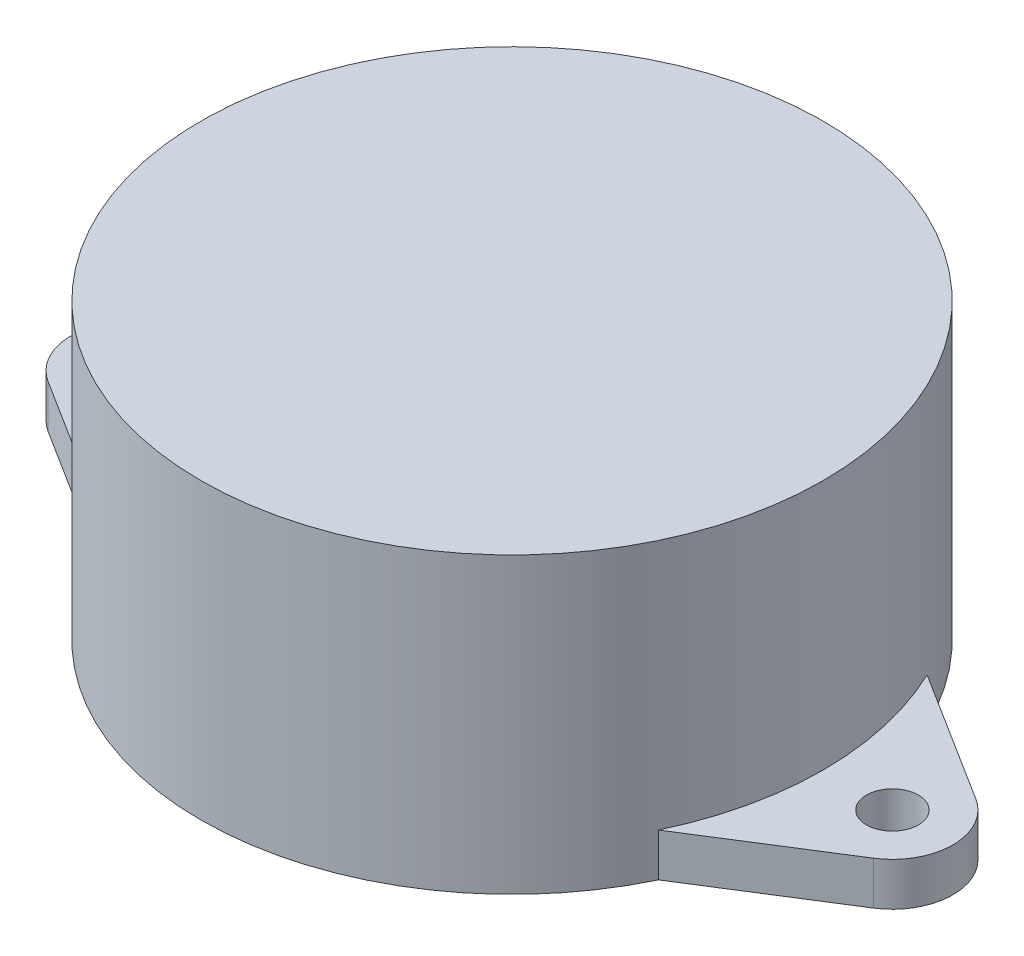
ISO-10303-21;
HEADER;
FILE_DESCRIPTION(('STEP AP214'),'2;1');
FILE_NAME('part.step','',(''),(''),'','','');
FILE_SCHEMA(('AUTOMOTIVE_DESIGN { 1 0 10303 214 1 1 1 1 }'));
ENDSEC;
DATA;
#1=APPLICATION_CONTEXT('core data for automotive mechanical design processes');
#2=APPLICATION_PROTOCOL_DEFINITION('international standard','automotive_design',2000,#1);
#3=PRODUCT_CONTEXT('',#1,'mechanical');
#4=PRODUCT('Part','Part','',(#3));
#5=PRODUCT_RELATED_PRODUCT_CATEGORY('part','',(#4));
#6=PRODUCT_DEFINITION_FORMATION('','',#4);
#7=PRODUCT_DEFINITION_CONTEXT('part definition',#1,'design');
#8=PRODUCT_DEFINITION('design','',#6,#7);
#9=PRODUCT_DEFINITION_SHAPE('','',#8);
#10=(LENGTH_UNIT() NAMED_UNIT(*) SI_UNIT(.MILLI.,.METRE.));
#11=(NAMED_UNIT(*) PLANE_ANGLE_UNIT() SI_UNIT($,.RADIAN.));
#12=(NAMED_UNIT(*) SI_UNIT($,.STERADIAN.) SOLID_ANGLE_UNIT());
#13=UNCERTAINTY_MEASURE_WITH_UNIT(LENGTH_MEASURE(1.E-05),#10,'distance_accuracy_value','');
#14=(GEOMETRIC_REPRESENTATION_CONTEXT(3) GLOBAL_UNCERTAINTY_ASSIGNED_CONTEXT((#13)) GLOBAL_UNIT_ASSIGNED_CONTEXT((#10,
#11,#12)) REPRESENTATION_CONTEXT('',''));
#15=CARTESIAN_POINT('',(0.,0.,0.));
#16=DIRECTION('',(0.,0.,1.));
#17=DIRECTION('',(1.,0.,0.));
#18=AXIS2_PLACEMENT_3D('',#15,#16,#17);
#19=CARTESIAN_POINT('',(0.,2.5,0.));
#20=DIRECTION('',(0.,1.,0.));
#21=DIRECTION('',(0.,0.,1.));
#22=AXIS2_PLACEMENT_3D('',#19,#20,#21);
#23=PLANE('',#22);
#24=CARTESIAN_POINT('',(-22.,2.5,0.));
#25=DIRECTION('',(0.,1.,0.));
#26=DIRECTION('',(0.,0.,1.));
#27=AXIS2_PLACEMENT_3D('',#24,#25,#26);
#28=CIRCLE('',#27,1.5);
#29=CARTESIAN_POINT('',(-22.,2.5,1.5));
#30=VERTEX_POINT('',#29);
#31=EDGE_CURVE('E138',#30,#30,#28,.T.);
#32=ORIENTED_EDGE('',*,*,#31,.F.);
#33=EDGE_LOOP('',(#32));
#34=FACE_BOUND('',#33,.T.);
#35=DIRECTION('',(0.846038247877732,0.,0.533122202809053));
#36=VECTOR('',#35,1.);
#37=CARTESIAN_POINT('',(-23.8659277098317,2.5,2.96113386757206));
#38=LINE('',#37,#36);
#39=CARTESIAN_POINT('',(-23.8659277098317,2.5,2.96113386757206));
#40=VERTEX_POINT('',#39);
#41=CARTESIAN_POINT('',(-16.2375038772944,2.5,7.76810580739281));
#42=VERTEX_POINT('',#41);
#43=EDGE_CURVE('E119',#40,#42,#38,.T.);
#44=ORIENTED_EDGE('',*,*,#43,.T.);
#45=CARTESIAN_POINT('',(0.,2.5,0.));
#46=DIRECTION('',(0.,1.,0.));
#47=DIRECTION('',(0.,0.,1.));
#48=AXIS2_PLACEMENT_3D('',#45,#46,#47);
#49=CIRCLE('',#48,18.);
#50=CARTESIAN_POINT('',(-16.2375038772944,2.5,-7.76810580739281));
#51=VERTEX_POINT('',#50);
#52=EDGE_CURVE('E98',#42,#51,#49,.F.);
#53=ORIENTED_EDGE('',*,*,#52,.T.);
#54=DIRECTION('',(-0.846038247877732,0.,0.533122202809053));
#55=VECTOR('',#54,1.);
#56=CARTESIAN_POINT('',(-16.2375038772944,2.5,-7.76810580739281));
#57=LINE('',#56,#55);
#58=CARTESIAN_POINT('',(-23.8659277098317,2.5,-2.96113386757206));
#59=VERTEX_POINT('',#58);
#60=EDGE_CURVE('E149',#51,#59,#57,.T.);
#61=ORIENTED_EDGE('',*,*,#60,.T.);
#62=CARTESIAN_POINT('',(-22.,2.5,0.));
#63=DIRECTION('',(0.,1.,0.));
#64=DIRECTION('',(0.,0.,1.));
#65=AXIS2_PLACEMENT_3D('',#62,#63,#64);
#66=CIRCLE('',#65,3.5);
#67=EDGE_CURVE('E190',#59,#40,#66,.T.);
#68=ORIENTED_EDGE('',*,*,#67,.T.);
#69=EDGE_LOOP('',(#44,#53,#61,#68));
#70=FACE_BOUND('',#69,.T.);
#71=ADVANCED_FACE('F34',(#34,#70),#23,.T.);
#72=CARTESIAN_POINT('',(22.,2.5,0.));
#73=DIRECTION('',(0.,1.,0.));
#74=DIRECTION('',(0.,0.,-1.));
#75=AXIS2_PLACEMENT_3D('',#72,#73,#74);
#76=CIRCLE('',#75,1.5);
#77=CARTESIAN_POINT('',(22.,2.5,-1.5));
#78=VERTEX_POINT('',#77);
#79=EDGE_CURVE('E178',#78,#78,#76,.T.);
#80=ORIENTED_EDGE('',*,*,#79,.F.);
#81=EDGE_LOOP('',(#80));
#82=FACE_BOUND('',#81,.T.);
#83=DIRECTION('',(-0.846038247877732,0.,-0.533122202809053));
#84=VECTOR('',#83,1.);
#85=CARTESIAN_POINT('',(16.2375038772944,2.5,-7.76810580739281));
#86=LINE('',#85,#84);
#87=CARTESIAN_POINT('',(23.8659277098317,2.5,-2.96113386757206));
#88=VERTEX_POINT('',#87);
#89=CARTESIAN_POINT('',(16.2375038772944,2.5,-7.76810580739281));
#90=VERTEX_POINT('',#89);
#91=EDGE_CURVE('E53',#88,#90,#86,.T.);
#92=ORIENTED_EDGE('',*,*,#91,.T.);
#93=CARTESIAN_POINT('',(16.2375038772944,2.5,7.76810580739281));
#94=VERTEX_POINT('',#93);
#95=EDGE_CURVE('E115',#90,#94,#49,.F.);
#96=ORIENTED_EDGE('',*,*,#95,.T.);
#97=DIRECTION('',(0.846038247877732,0.,-0.533122202809053));
#98=VECTOR('',#97,1.);
#99=CARTESIAN_POINT('',(23.8659277098317,2.5,2.96113386757206));
#100=LINE('',#99,#98);
#101=CARTESIAN_POINT('',(23.8659277098317,2.5,2.96113386757206));
#102=VERTEX_POINT('',#101);
#103=EDGE_CURVE('E109',#94,#102,#100,.T.);
#104=ORIENTED_EDGE('',*,*,#103,.T.);
#105=CARTESIAN_POINT('',(22.,2.5,0.));
#106=DIRECTION('',(0.,1.,0.));
#107=DIRECTION('',(0.,0.,-1.));
#108=AXIS2_PLACEMENT_3D('',#105,#106,#107);
#109=CIRCLE('',#108,3.5);
#110=EDGE_CURVE('E113',#102,#88,#109,.T.);
#111=ORIENTED_EDGE('',*,*,#110,.T.);
#112=EDGE_LOOP('',(#92,#96,#104,#111));
#113=FACE_BOUND('',#112,.T.);
#114=ADVANCED_FACE('F111',(#82,#113),#23,.T.);
#115=CARTESIAN_POINT('',(0.,0.,0.));
#116=DIRECTION('',(0.,1.,0.));
#117=DIRECTION('',(0.,0.,1.));
#118=AXIS2_PLACEMENT_3D('',#115,#116,#117);
#119=PLANE('',#118);
#120=CARTESIAN_POINT('',(0.,0.,0.));
#121=DIRECTION('',(0.,-1.,0.));
#122=DIRECTION('',(0.,0.,-1.));
#123=AXIS2_PLACEMENT_3D('',#120,#121,#122);
#124=CIRCLE('',#123,8.);
#125=CARTESIAN_POINT('',(0.,0.,-8.));
#126=VERTEX_POINT('',#125);
#127=EDGE_CURVE('E44',#126,#126,#124,.T.);
#128=ORIENTED_EDGE('',*,*,#127,.F.);
#129=EDGE_LOOP('',(#128));
#130=FACE_BOUND('',#129,.T.);
#131=CARTESIAN_POINT('',(0.,0.,0.));
#132=DIRECTION('',(0.,1.,0.));
#133=DIRECTION('',(0.,0.,1.));
#134=AXIS2_PLACEMENT_3D('',#131,#132,#133);
#135=CIRCLE('',#134,18.);
#136=CARTESIAN_POINT('',(-16.2375038772944,0.,7.76810580739281));
#137=VERTEX_POINT('',#136);
#138=CARTESIAN_POINT('',(16.2375038772944,0.,7.76810580739281));
#139=VERTEX_POINT('',#138);
#140=EDGE_CURVE('E144',#137,#139,#135,.T.);
#141=ORIENTED_EDGE('',*,*,#140,.F.);
#142=DIRECTION('',(0.846038247877732,0.,0.533122202809053));
#143=VECTOR('',#142,1.);
#144=CARTESIAN_POINT('',(-23.8659277098317,0.,2.96113386757206));
#145=LINE('',#144,#143);
#146=CARTESIAN_POINT('',(-23.8659277098317,0.,2.96113386757206));
#147=VERTEX_POINT('',#146);
#148=EDGE_CURVE('E142',#147,#137,#145,.T.);
#149=ORIENTED_EDGE('',*,*,#148,.F.);
#150=CARTESIAN_POINT('',(-22.,0.,0.));
#151=DIRECTION('',(0.,1.,0.));
#152=DIRECTION('',(0.,0.,1.));
#153=AXIS2_PLACEMENT_3D('',#150,#151,#152);
#154=CIRCLE('',#153,3.5);
#155=CARTESIAN_POINT('',(-23.8659277098317,0.,-2.96113386757206));
#156=VERTEX_POINT('',#155);
#157=EDGE_CURVE('E140',#156,#147,#154,.T.);
#158=ORIENTED_EDGE('',*,*,#157,.F.);
#159=DIRECTION('',(-0.846038247877732,0.,0.533122202809053));
#160=VECTOR('',#159,1.);
#161=CARTESIAN_POINT('',(-16.2375038772944,0.,-7.76810580739281));
#162=LINE('',#161,#160);
#163=CARTESIAN_POINT('',(-16.2375038772944,0.,-7.76810580739281));
#164=VERTEX_POINT('',#163);
#165=EDGE_CURVE('E137',#164,#156,#162,.T.);
#166=ORIENTED_EDGE('',*,*,#165,.F.);
#167=CARTESIAN_POINT('',(0.,0.,0.));
#168=DIRECTION('',(0.,1.,0.));
#169=DIRECTION('',(0.,0.,1.));
#170=AXIS2_PLACEMENT_3D('',#167,#168,#169);
#171=CIRCLE('',#170,18.);
#172=CARTESIAN_POINT('',(16.2375038772944,0.,-7.76810580739281));
#173=VERTEX_POINT('',#172);
#174=EDGE_CURVE('E134',#173,#164,#171,.T.);
#175=ORIENTED_EDGE('',*,*,#174,.F.);
#176=DIRECTION('',(-0.846038247877732,0.,-0.533122202809053));
#177=VECTOR('',#176,1.);
#178=CARTESIAN_POINT('',(16.2375038772944,0.,-7.76810580739281));
#179=LINE('',#178,#177);
#180=CARTESIAN_POINT('',(23.8659277098317,0.,-2.96113386757206));
#181=VERTEX_POINT('',#180);
#182=EDGE_CURVE('E89',#181,#173,#179,.T.);
#183=ORIENTED_EDGE('',*,*,#182,.F.);
#184=CARTESIAN_POINT('',(22.,0.,0.));
#185=DIRECTION('',(0.,1.,0.));
#186=DIRECTION('',(0.,0.,-1.));
#187=AXIS2_PLACEMENT_3D('',#184,#185,#186);
#188=CIRCLE('',#187,3.5);
#189=CARTESIAN_POINT('',(23.8659277098317,0.,2.96113386757206));
#190=VERTEX_POINT('',#189);
#191=EDGE_CURVE('E83',#190,#181,#188,.T.);
#192=ORIENTED_EDGE('',*,*,#191,.F.);
#193=DIRECTION('',(0.846038247877732,0.,-0.533122202809053));
#194=VECTOR('',#193,1.);
#195=CARTESIAN_POINT('',(23.8659277098317,0.,2.96113386757206));
#196=LINE('',#195,#194);
#197=EDGE_CURVE('E124',#139,#190,#196,.T.);
#198=ORIENTED_EDGE('',*,*,#197,.F.);
#199=EDGE_LOOP('',(#141,#149,#158,#166,#175,#183,#192,#198));
#200=FACE_BOUND('',#199,.T.);
#201=CARTESIAN_POINT('',(22.,0.,0.));
#202=DIRECTION('',(0.,1.,0.));
#203=DIRECTION('',(0.,0.,-1.));
#204=AXIS2_PLACEMENT_3D('',#201,#202,#203);
#205=CIRCLE('',#204,1.5);
#206=CARTESIAN_POINT('',(22.,0.,-1.5));
#207=VERTEX_POINT('',#206);
#208=EDGE_CURVE('E182',#207,#207,#205,.T.);
#209=ORIENTED_EDGE('',*,*,#208,.T.);
#210=EDGE_LOOP('',(#209));
#211=FACE_BOUND('',#210,.T.);
#212=CARTESIAN_POINT('',(-22.,0.,0.));
#213=DIRECTION('',(0.,1.,0.));
#214=DIRECTION('',(0.,0.,1.));
#215=AXIS2_PLACEMENT_3D('',#212,#213,#214);
#216=CIRCLE('',#215,1.5);
#217=CARTESIAN_POINT('',(-22.,0.,1.5));
#218=VERTEX_POINT('',#217);
#219=EDGE_CURVE('E181',#218,#218,#216,.T.);
#220=ORIENTED_EDGE('',*,*,#219,.T.);
#221=EDGE_LOOP('',(#220));
#222=FACE_BOUND('',#221,.T.);
#223=ADVANCED_FACE('F203',(#130,#200,#211,#222),#119,.F.);
#224=CARTESIAN_POINT('',(-16.2375038772944,2.5,-7.76810580739281));
#225=DIRECTION('',(0.533122202809053,0.,0.846038247877732));
#226=DIRECTION('',(0.846038247877732,0.,-0.533122202809053));
#227=AXIS2_PLACEMENT_3D('',#224,#225,#226);
#228=PLANE('',#227);
#229=ORIENTED_EDGE('',*,*,#165,.T.);
#230=DIRECTION('',(0.,-1.,0.));
#231=VECTOR('',#230,1.);
#232=CARTESIAN_POINT('',(-23.8659277098317,2.5,-2.96113386757206));
#233=LINE('',#232,#231);
#234=EDGE_CURVE('E158',#59,#156,#233,.T.);
#235=ORIENTED_EDGE('',*,*,#234,.F.);
#236=ORIENTED_EDGE('',*,*,#60,.F.);
#237=DIRECTION('',(0.,-1.,0.));
#238=VECTOR('',#237,1.);
#239=CARTESIAN_POINT('',(-16.2375038772944,2.5,-7.76810580739281));
#240=LINE('',#239,#238);
#241=EDGE_CURVE('E38',#51,#164,#240,.T.);
#242=ORIENTED_EDGE('',*,*,#241,.T.);
#243=EDGE_LOOP('',(#229,#235,#236,#242));
#244=FACE_BOUND('',#243,.T.);
#245=ADVANCED_FACE('F36',(#244),#228,.F.);
#246=CARTESIAN_POINT('',(-22.,2.5,0.));
#247=DIRECTION('',(0.,-1.,0.));
#248=DIRECTION('',(0.,0.,-1.));
#249=AXIS2_PLACEMENT_3D('',#246,#247,#248);
#250=CYLINDRICAL_SURFACE('',#249,3.5);
#251=ORIENTED_EDGE('',*,*,#157,.T.);
#252=DIRECTION('',(0.,-1.,0.));
#253=VECTOR('',#252,1.);
#254=CARTESIAN_POINT('',(-23.8659277098317,2.5,2.96113386757206));
#255=LINE('',#254,#253);
#256=EDGE_CURVE('E156',#40,#147,#255,.T.);
#257=ORIENTED_EDGE('',*,*,#256,.F.);
#258=ORIENTED_EDGE('',*,*,#67,.F.);
#259=ORIENTED_EDGE('',*,*,#234,.T.);
#260=EDGE_LOOP('',(#251,#257,#258,#259));
#261=FACE_BOUND('',#260,.T.);
#262=ADVANCED_FACE('F205',(#261),#250,.T.);
#263=CARTESIAN_POINT('',(-23.8659277098317,2.5,2.96113386757206));
#264=DIRECTION('',(0.533122202809053,0.,-0.846038247877732));
#265=DIRECTION('',(-0.846038247877732,0.,-0.533122202809053));
#266=AXIS2_PLACEMENT_3D('',#263,#264,#265);
#267=PLANE('',#266);
#268=ORIENTED_EDGE('',*,*,#148,.T.);
#269=DIRECTION('',(0.,-1.,0.));
#270=VECTOR('',#269,1.);
#271=CARTESIAN_POINT('',(-16.2375038772944,2.5,7.76810580739281));
#272=LINE('',#271,#270);
#273=EDGE_CURVE('E153',#42,#137,#272,.T.);
#274=ORIENTED_EDGE('',*,*,#273,.F.);
#275=ORIENTED_EDGE('',*,*,#43,.F.);
#276=ORIENTED_EDGE('',*,*,#256,.T.);
#277=EDGE_LOOP('',(#268,#274,#275,#276));
#278=FACE_BOUND('',#277,.T.);
#279=ADVANCED_FACE('F195',(#278),#267,.F.);
#280=CARTESIAN_POINT('',(0.,2.5,0.));
#281=DIRECTION('',(0.,-1.,0.));
#282=DIRECTION('',(0.,0.,-1.));
#283=AXIS2_PLACEMENT_3D('',#280,#281,#282);
#284=CYLINDRICAL_SURFACE('',#283,18.);
#285=ORIENTED_EDGE('',*,*,#140,.T.);
#286=DIRECTION('',(0.,-1.,0.));
#287=VECTOR('',#286,1.);
#288=CARTESIAN_POINT('',(16.2375038772944,2.5,7.76810580739281));
#289=LINE('',#288,#287);
#290=EDGE_CURVE('E125',#94,#139,#289,.T.);
#291=ORIENTED_EDGE('',*,*,#290,.F.);
#292=ORIENTED_EDGE('',*,*,#95,.F.);
#293=DIRECTION('',(0.,-1.,0.));
#294=VECTOR('',#293,1.);
#295=CARTESIAN_POINT('',(16.2375038772944,2.5,-7.76810580739281));
#296=LINE('',#295,#294);
#297=EDGE_CURVE('E130',#90,#173,#296,.T.);
#298=ORIENTED_EDGE('',*,*,#297,.T.);
#299=ORIENTED_EDGE('',*,*,#174,.T.);
#300=ORIENTED_EDGE('',*,*,#241,.F.);
#301=ORIENTED_EDGE('',*,*,#52,.F.);
#302=ORIENTED_EDGE('',*,*,#273,.T.);
#303=EDGE_LOOP('',(#285,#291,#292,#298,#299,#300,#301,#302));
#304=FACE_BOUND('',#303,.T.);
#305=CARTESIAN_POINT('',(0.,17.,0.));
#306=DIRECTION('',(0.,1.,0.));
#307=DIRECTION('',(0.,0.,1.));
#308=AXIS2_PLACEMENT_3D('',#305,#306,#307);
#309=CIRCLE('',#308,18.);
#310=CARTESIAN_POINT('',(0.,17.,18.));
#311=VERTEX_POINT('',#310);
#312=EDGE_CURVE('E174',#311,#311,#309,.T.);
#313=ORIENTED_EDGE('',*,*,#312,.F.);
#314=EDGE_LOOP('',(#313));
#315=FACE_BOUND('',#314,.T.);
#316=ADVANCED_FACE('F199',(#304,#315),#284,.T.);
#317=CARTESIAN_POINT('',(23.8659277098317,2.5,2.96113386757206));
#318=DIRECTION('',(-0.533122202809053,0.,-0.846038247877732));
#319=DIRECTION('',(-0.846038247877732,0.,0.533122202809053));
#320=AXIS2_PLACEMENT_3D('',#317,#318,#319);
#321=PLANE('',#320);
#322=ORIENTED_EDGE('',*,*,#197,.T.);
#323=DIRECTION('',(0.,-1.,0.));
#324=VECTOR('',#323,1.);
#325=CARTESIAN_POINT('',(23.8659277098317,2.5,2.96113386757206));
#326=LINE('',#325,#324);
#327=EDGE_CURVE('E121',#102,#190,#326,.T.);
#328=ORIENTED_EDGE('',*,*,#327,.F.);
#329=ORIENTED_EDGE('',*,*,#103,.F.);
#330=ORIENTED_EDGE('',*,*,#290,.T.);
#331=EDGE_LOOP('',(#322,#328,#329,#330));
#332=FACE_BOUND('',#331,.T.);
#333=ADVANCED_FACE('F122',(#332),#321,.F.);
#334=CARTESIAN_POINT('',(22.,2.5,0.));
#335=DIRECTION('',(0.,-1.,0.));
#336=DIRECTION('',(0.,0.,-1.));
#337=AXIS2_PLACEMENT_3D('',#334,#335,#336);
#338=CYLINDRICAL_SURFACE('',#337,3.5);
#339=ORIENTED_EDGE('',*,*,#191,.T.);
#340=DIRECTION('',(0.,-1.,0.));
#341=VECTOR('',#340,1.);
#342=CARTESIAN_POINT('',(23.8659277098317,2.5,-2.96113386757206));
#343=LINE('',#342,#341);
#344=EDGE_CURVE('E126',#88,#181,#343,.T.);
#345=ORIENTED_EDGE('',*,*,#344,.F.);
#346=ORIENTED_EDGE('',*,*,#110,.F.);
#347=ORIENTED_EDGE('',*,*,#327,.T.);
#348=EDGE_LOOP('',(#339,#345,#346,#347));
#349=FACE_BOUND('',#348,.T.);
#350=ADVANCED_FACE('F128',(#349),#338,.T.);
#351=CARTESIAN_POINT('',(16.2375038772944,2.5,-7.76810580739281));
#352=DIRECTION('',(-0.533122202809053,0.,0.846038247877732));
#353=DIRECTION('',(0.846038247877732,0.,0.533122202809053));
#354=AXIS2_PLACEMENT_3D('',#351,#352,#353);
#355=PLANE('',#354);
#356=ORIENTED_EDGE('',*,*,#182,.T.);
#357=ORIENTED_EDGE('',*,*,#297,.F.);
#358=ORIENTED_EDGE('',*,*,#91,.F.);
#359=ORIENTED_EDGE('',*,*,#344,.T.);
#360=EDGE_LOOP('',(#356,#357,#358,#359));
#361=FACE_BOUND('',#360,.T.);
#362=ADVANCED_FACE('F227',(#361),#355,.F.);
#363=CARTESIAN_POINT('',(-22.,2.5,0.));
#364=DIRECTION('',(0.,-1.,0.));
#365=DIRECTION('',(0.,0.,-1.));
#366=AXIS2_PLACEMENT_3D('',#363,#364,#365);
#367=CYLINDRICAL_SURFACE('',#366,1.5);
#368=ORIENTED_EDGE('',*,*,#31,.T.);
#369=EDGE_LOOP('',(#368));
#370=FACE_BOUND('',#369,.T.);
#371=ORIENTED_EDGE('',*,*,#219,.F.);
#372=EDGE_LOOP('',(#371));
#373=FACE_BOUND('',#372,.T.);
#374=ADVANCED_FACE('F222',(#370,#373),#367,.F.);
#375=CARTESIAN_POINT('',(22.,2.5,0.));
#376=DIRECTION('',(0.,-1.,0.));
#377=DIRECTION('',(0.,0.,-1.));
#378=AXIS2_PLACEMENT_3D('',#375,#376,#377);
#379=CYLINDRICAL_SURFACE('',#378,1.5);
#380=ORIENTED_EDGE('',*,*,#79,.T.);
#381=EDGE_LOOP('',(#380));
#382=FACE_BOUND('',#381,.T.);
#383=ORIENTED_EDGE('',*,*,#208,.F.);
#384=EDGE_LOOP('',(#383));
#385=FACE_BOUND('',#384,.T.);
#386=ADVANCED_FACE('F258',(#382,#385),#379,.F.);
#387=CARTESIAN_POINT('',(0.,17.,0.));
#388=DIRECTION('',(0.,1.,0.));
#389=DIRECTION('',(0.,0.,1.));
#390=AXIS2_PLACEMENT_3D('',#387,#388,#389);
#391=PLANE('',#390);
#392=ORIENTED_EDGE('',*,*,#312,.T.);
#393=EDGE_LOOP('',(#392));
#394=FACE_BOUND('',#393,.T.);
#395=ADVANCED_FACE('F265',(#394),#391,.T.);
#396=CARTESIAN_POINT('',(0.,-1.8,0.));
#397=DIRECTION('',(0.,1.,0.));
#398=DIRECTION('',(0.,0.,1.));
#399=AXIS2_PLACEMENT_3D('',#396,#397,#398);
#400=CYLINDRICAL_SURFACE('',#399,8.);
#401=CARTESIAN_POINT('',(0.,-1.8,0.));
#402=DIRECTION('',(0.,-1.,0.));
#403=DIRECTION('',(0.,0.,-1.));
#404=AXIS2_PLACEMENT_3D('',#401,#402,#403);
#405=CIRCLE('',#404,8.);
#406=CARTESIAN_POINT('',(0.,-1.8,-8.));
#407=VERTEX_POINT('',#406);
#408=EDGE_CURVE('E173',#407,#407,#405,.T.);
#409=ORIENTED_EDGE('',*,*,#408,.F.);
#410=EDGE_LOOP('',(#409));
#411=FACE_BOUND('',#410,.T.);
#412=ORIENTED_EDGE('',*,*,#127,.T.);
#413=EDGE_LOOP('',(#412));
#414=FACE_BOUND('',#413,.T.);
#415=ADVANCED_FACE('F271',(#411,#414),#400,.T.);
#416=CARTESIAN_POINT('',(0.,-1.8,0.));
#417=DIRECTION('',(0.,-1.,0.));
#418=DIRECTION('',(0.,0.,-1.));
#419=AXIS2_PLACEMENT_3D('',#416,#417,#418);
#420=PLANE('',#419);
#421=CARTESIAN_POINT('',(0.,-1.8,0.));
#422=DIRECTION('',(0.,-1.,0.));
#423=DIRECTION('',(0.,0.,-1.));
#424=AXIS2_PLACEMENT_3D('',#421,#422,#423);
#425=CIRCLE('',#424,2.5);
#426=CARTESIAN_POINT('',(0.,-1.8,-2.5));
#427=VERTEX_POINT('',#426);
#428=EDGE_CURVE('E11',#427,#427,#425,.T.);
#429=ORIENTED_EDGE('',*,*,#428,.F.);
#430=EDGE_LOOP('',(#429));
#431=FACE_BOUND('',#430,.T.);
#432=ORIENTED_EDGE('',*,*,#408,.T.);
#433=EDGE_LOOP('',(#432));
#434=FACE_BOUND('',#433,.T.);
#435=ADVANCED_FACE('F280',(#431,#434),#420,.T.);
#436=CARTESIAN_POINT('',(0.,-6.8,0.));
#437=DIRECTION('',(0.,1.,0.));
#438=DIRECTION('',(0.,0.,1.));
#439=AXIS2_PLACEMENT_3D('',#436,#437,#438);
#440=CYLINDRICAL_SURFACE('',#439,2.5);
#441=CARTESIAN_POINT('',(0.,-6.8,0.));
#442=DIRECTION('',(0.,-1.,0.));
#443=DIRECTION('',(0.,0.,-1.));
#444=AXIS2_PLACEMENT_3D('',#441,#442,#443);
#445=CIRCLE('',#444,2.5);
#446=CARTESIAN_POINT('',(0.,-6.8,-2.5));
#447=VERTEX_POINT('',#446);
#448=EDGE_CURVE('E366',#447,#447,#445,.T.);
#449=ORIENTED_EDGE('',*,*,#448,.F.);
#450=EDGE_LOOP('',(#449));
#451=FACE_BOUND('',#450,.T.);
#452=ORIENTED_EDGE('',*,*,#428,.T.);
#453=EDGE_LOOP('',(#452));
#454=FACE_BOUND('',#453,.T.);
#455=ADVANCED_FACE('F288',(#451,#454),#440,.T.);
#456=CARTESIAN_POINT('',(0.,-6.8,0.));
#457=DIRECTION('',(0.,-1.,0.));
#458=DIRECTION('',(0.,0.,-1.));
#459=AXIS2_PLACEMENT_3D('',#456,#457,#458);
#460=PLANE('',#459);
#461=ORIENTED_EDGE('',*,*,#448,.T.);
#462=EDGE_LOOP('',(#461));
#463=FACE_BOUND('',#462,.T.);
#464=ADVANCED_FACE('F296',(#463),#460,.T.);
#465=CLOSED_SHELL('',(#71,#114,#223,#245,#262,#279,#316,#333,#350,#362,#374,#386,#395,#415,#435,
#455,#464));
#466=MANIFOLD_SOLID_BREP('B2',#465);
#467=ADVANCED_BREP_SHAPE_REPRESENTATION('',(#18,#466),#14);
#468=SHAPE_DEFINITION_REPRESENTATION(#9,#467);
ENDSEC;
END-ISO-10303-21;
